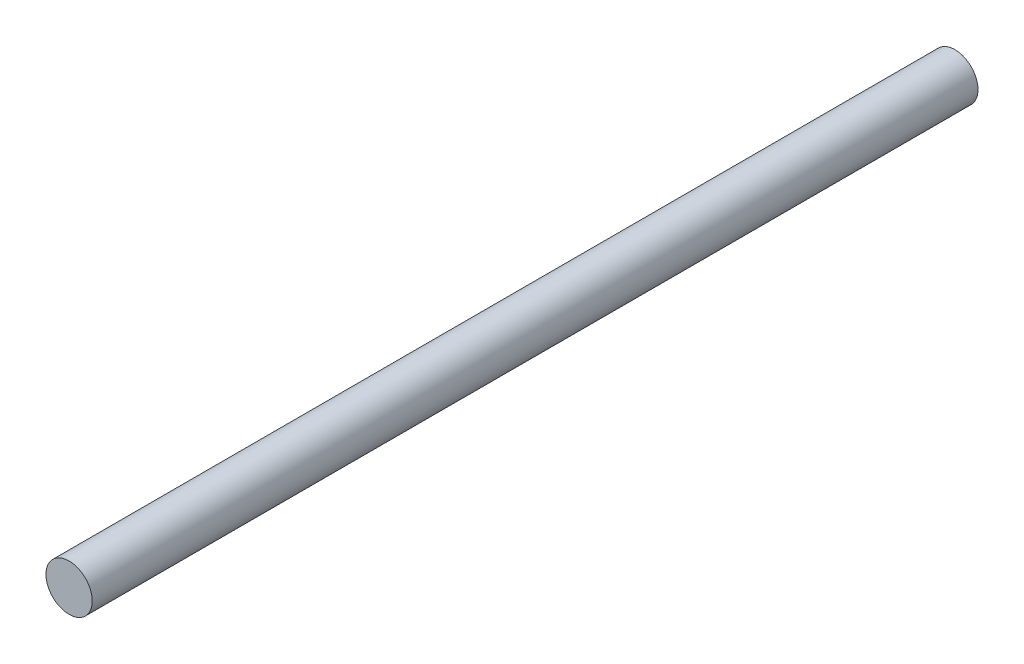
ISO-10303-21;
HEADER;
FILE_DESCRIPTION(('STEP AP214'),'2;1');
FILE_NAME('part.step','',(''),(''),'','','');
FILE_SCHEMA(('AUTOMOTIVE_DESIGN { 1 0 10303 214 1 1 1 1 }'));
ENDSEC;
DATA;
#1=APPLICATION_CONTEXT('core data for automotive mechanical design processes');
#2=APPLICATION_PROTOCOL_DEFINITION('international standard','automotive_design',2000,#1);
#3=PRODUCT_CONTEXT('',#1,'mechanical');
#4=PRODUCT('Part','Part','',(#3));
#5=PRODUCT_RELATED_PRODUCT_CATEGORY('part','',(#4));
#6=PRODUCT_DEFINITION_FORMATION('','',#4);
#7=PRODUCT_DEFINITION_CONTEXT('part definition',#1,'design');
#8=PRODUCT_DEFINITION('design','',#6,#7);
#9=PRODUCT_DEFINITION_SHAPE('','',#8);
#10=(LENGTH_UNIT() NAMED_UNIT(*) SI_UNIT(.MILLI.,.METRE.));
#11=(NAMED_UNIT(*) PLANE_ANGLE_UNIT() SI_UNIT($,.RADIAN.));
#12=(NAMED_UNIT(*) SI_UNIT($,.STERADIAN.) SOLID_ANGLE_UNIT());
#13=UNCERTAINTY_MEASURE_WITH_UNIT(LENGTH_MEASURE(1.E-05),#10,'distance_accuracy_value','');
#14=(GEOMETRIC_REPRESENTATION_CONTEXT(3) GLOBAL_UNCERTAINTY_ASSIGNED_CONTEXT((#13)) GLOBAL_UNIT_ASSIGNED_CONTEXT((#10,
#11,#12)) REPRESENTATION_CONTEXT('',''));
#15=CARTESIAN_POINT('',(0.,0.,0.));
#16=DIRECTION('',(0.,0.,1.));
#17=DIRECTION('',(1.,0.,0.));
#18=AXIS2_PLACEMENT_3D('',#15,#16,#17);
#19=CARTESIAN_POINT('',(0.,0.,197.755844122716));
#20=DIRECTION('',(0.,0.,-1.));
#21=DIRECTION('',(-1.,0.,0.));
#22=AXIS2_PLACEMENT_3D('',#19,#20,#21);
#23=CYLINDRICAL_SURFACE('',#22,9.);
#24=CARTESIAN_POINT('',(0.,0.,172.3));
#25=DIRECTION('',(0.,0.,1.));
#26=DIRECTION('',(1.,0.,0.));
#27=AXIS2_PLACEMENT_3D('',#24,#25,#26);
#28=CIRCLE('',#27,9.);
#29=CARTESIAN_POINT('',(9.,0.,172.3));
#30=VERTEX_POINT('',#29);
#31=EDGE_CURVE('E10',#30,#30,#28,.T.);
#32=ORIENTED_EDGE('',*,*,#31,.F.);
#33=EDGE_LOOP('',(#32));
#34=FACE_BOUND('',#33,.T.);
#35=CARTESIAN_POINT('',(0.,0.,-172.3));
#36=DIRECTION('',(0.,0.,1.));
#37=DIRECTION('',(1.,0.,0.));
#38=AXIS2_PLACEMENT_3D('',#35,#36,#37);
#39=CIRCLE('',#38,9.);
#40=CARTESIAN_POINT('',(9.,0.,-172.3));
#41=VERTEX_POINT('',#40);
#42=EDGE_CURVE('E40',#41,#41,#39,.T.);
#43=ORIENTED_EDGE('',*,*,#42,.T.);
#44=EDGE_LOOP('',(#43));
#45=FACE_BOUND('',#44,.T.);
#46=ADVANCED_FACE('F33',(#34,#45),#23,.T.);
#47=CARTESIAN_POINT('',(0.,-216.,172.3));
#48=DIRECTION('',(0.,0.,1.));
#49=DIRECTION('',(1.,0.,0.));
#50=AXIS2_PLACEMENT_3D('',#47,#48,#49);
#51=PLANE('',#50);
#52=ORIENTED_EDGE('',*,*,#31,.T.);
#53=EDGE_LOOP('',(#52));
#54=FACE_BOUND('',#53,.T.);
#55=ADVANCED_FACE('F35',(#54),#51,.T.);
#56=CARTESIAN_POINT('',(0.,-216.,-172.3));
#57=DIRECTION('',(0.,0.,-1.));
#58=DIRECTION('',(1.,0.,0.));
#59=AXIS2_PLACEMENT_3D('',#56,#57,#58);
#60=PLANE('',#59);
#61=ORIENTED_EDGE('',*,*,#42,.F.);
#62=EDGE_LOOP('',(#61));
#63=FACE_BOUND('',#62,.T.);
#64=ADVANCED_FACE('F47',(#63),#60,.T.);
#65=CLOSED_SHELL('',(#46,#55,#64));
#66=MANIFOLD_SOLID_BREP('B2',#65);
#67=ADVANCED_BREP_SHAPE_REPRESENTATION('',(#18,#66),#14);
#68=SHAPE_DEFINITION_REPRESENTATION(#9,#67);
ENDSEC;
END-ISO-10303-21;
